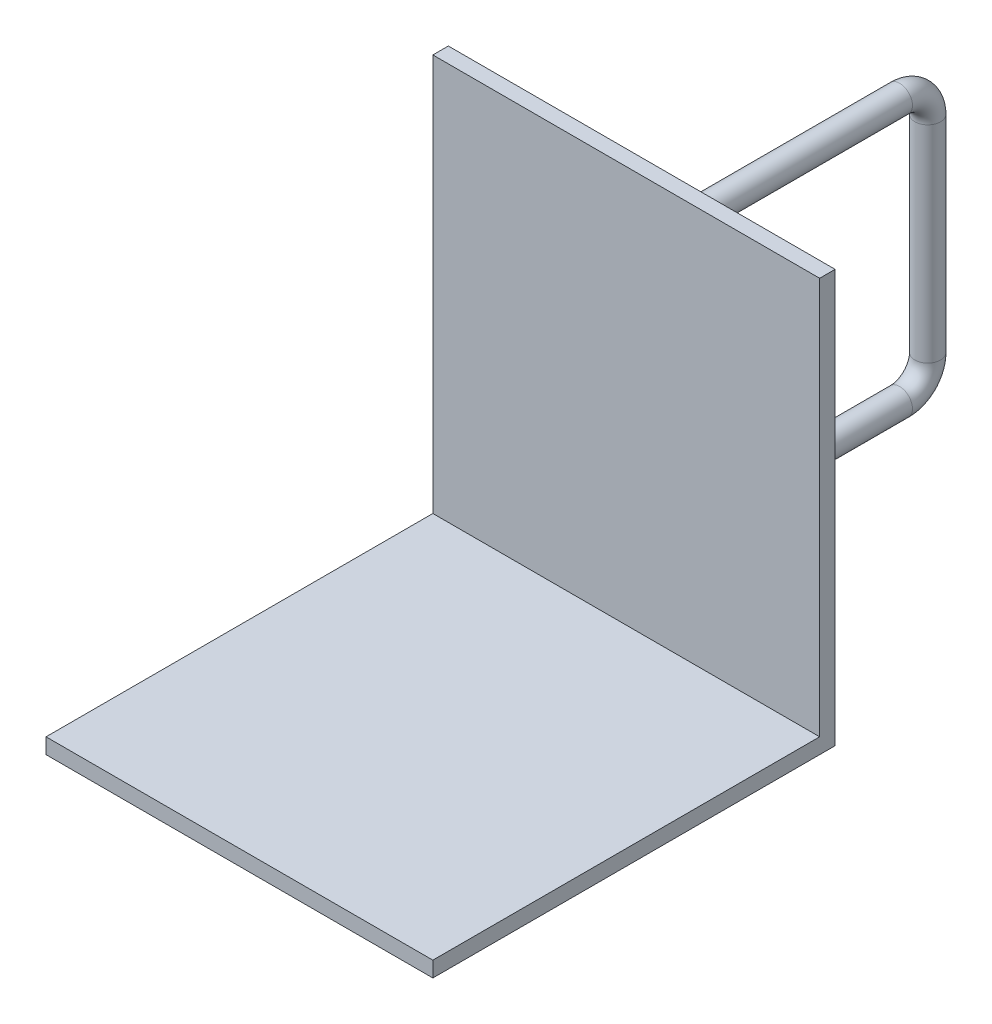
ISO-10303-21;
HEADER;
FILE_DESCRIPTION(('STEP AP214'),'2;1');
FILE_NAME('part.step','',(''),(''),'','','');
FILE_SCHEMA(('AUTOMOTIVE_DESIGN { 1 0 10303 214 1 1 1 1 }'));
ENDSEC;
DATA;
#1=APPLICATION_CONTEXT('core data for automotive mechanical design processes');
#2=APPLICATION_PROTOCOL_DEFINITION('international standard','automotive_design',2000,#1);
#3=PRODUCT_CONTEXT('',#1,'mechanical');
#4=PRODUCT('Part','Part','',(#3));
#5=PRODUCT_RELATED_PRODUCT_CATEGORY('part','',(#4));
#6=PRODUCT_DEFINITION_FORMATION('','',#4);
#7=PRODUCT_DEFINITION_CONTEXT('part definition',#1,'design');
#8=PRODUCT_DEFINITION('design','',#6,#7);
#9=PRODUCT_DEFINITION_SHAPE('','',#8);
#10=(LENGTH_UNIT() NAMED_UNIT(*) SI_UNIT(.MILLI.,.METRE.));
#11=(NAMED_UNIT(*) PLANE_ANGLE_UNIT() SI_UNIT($,.RADIAN.));
#12=(NAMED_UNIT(*) SI_UNIT($,.STERADIAN.) SOLID_ANGLE_UNIT());
#13=UNCERTAINTY_MEASURE_WITH_UNIT(LENGTH_MEASURE(1.E-05),#10,'distance_accuracy_value','');
#14=(GEOMETRIC_REPRESENTATION_CONTEXT(3) GLOBAL_UNCERTAINTY_ASSIGNED_CONTEXT((#13)) GLOBAL_UNIT_ASSIGNED_CONTEXT((#10,
#11,#12)) REPRESENTATION_CONTEXT('',''));
#15=CARTESIAN_POINT('',(0.,0.,0.));
#16=DIRECTION('',(0.,0.,1.));
#17=DIRECTION('',(1.,0.,0.));
#18=AXIS2_PLACEMENT_3D('',#15,#16,#17);
#19=CARTESIAN_POINT('',(0.,0.,3.));
#20=DIRECTION('',(-1.,0.,0.));
#21=DIRECTION('',(0.,0.,1.));
#22=AXIS2_PLACEMENT_3D('',#19,#20,#21);
#23=PLANE('',#22);
#24=DIRECTION('',(0.,1.,0.));
#25=VECTOR('',#24,1.);
#26=CARTESIAN_POINT('',(0.,0.,0.));
#27=LINE('',#26,#25);
#28=CARTESIAN_POINT('',(0.,0.,0.));
#29=VERTEX_POINT('',#28);
#30=CARTESIAN_POINT('',(0.,80.,0.));
#31=VERTEX_POINT('',#30);
#32=EDGE_CURVE('E92',#29,#31,#27,.T.);
#33=ORIENTED_EDGE('',*,*,#32,.T.);
#34=DIRECTION('',(0.,0.,-1.));
#35=VECTOR('',#34,1.);
#36=CARTESIAN_POINT('',(0.,80.,3.));
#37=LINE('',#36,#35);
#38=CARTESIAN_POINT('',(0.,80.,3.));
#39=VERTEX_POINT('',#38);
#40=EDGE_CURVE('E11',#39,#31,#37,.T.);
#41=ORIENTED_EDGE('',*,*,#40,.F.);
#42=DIRECTION('',(0.,1.,0.));
#43=VECTOR('',#42,1.);
#44=CARTESIAN_POINT('',(0.,0.,3.));
#45=LINE('',#44,#43);
#46=CARTESIAN_POINT('',(0.,3.,3.));
#47=VERTEX_POINT('',#46);
#48=EDGE_CURVE('E85',#47,#39,#45,.T.);
#49=ORIENTED_EDGE('',*,*,#48,.F.);
#50=DIRECTION('',(0.,0.,-1.));
#51=VECTOR('',#50,1.);
#52=CARTESIAN_POINT('',(0.,3.,78.));
#53=LINE('',#52,#51);
#54=CARTESIAN_POINT('',(0.,3.,78.));
#55=VERTEX_POINT('',#54);
#56=EDGE_CURVE('E100',#55,#47,#53,.T.);
#57=ORIENTED_EDGE('',*,*,#56,.F.);
#58=DIRECTION('',(0.,1.,0.));
#59=VECTOR('',#58,1.);
#60=CARTESIAN_POINT('',(0.,0.,78.));
#61=LINE('',#60,#59);
#62=CARTESIAN_POINT('',(0.,0.,78.));
#63=VERTEX_POINT('',#62);
#64=EDGE_CURVE('E95',#63,#55,#61,.T.);
#65=ORIENTED_EDGE('',*,*,#64,.F.);
#66=DIRECTION('',(0.,0.,-1.));
#67=VECTOR('',#66,1.);
#68=CARTESIAN_POINT('',(0.,0.,3.));
#69=LINE('',#68,#67);
#70=EDGE_CURVE('E78',#63,#29,#69,.T.);
#71=ORIENTED_EDGE('',*,*,#70,.T.);
#72=EDGE_LOOP('',(#33,#41,#49,#57,#65,#71));
#73=FACE_BOUND('',#72,.T.);
#74=ADVANCED_FACE('F33',(#73),#23,.F.);
#75=CARTESIAN_POINT('',(0.,80.,3.));
#76=DIRECTION('',(0.,-1.,0.));
#77=DIRECTION('',(1.,0.,0.));
#78=AXIS2_PLACEMENT_3D('',#75,#76,#77);
#79=PLANE('',#78);
#80=DIRECTION('',(-1.,0.,0.));
#81=VECTOR('',#80,1.);
#82=CARTESIAN_POINT('',(0.,80.,0.));
#83=LINE('',#82,#81);
#84=CARTESIAN_POINT('',(-75.,80.,0.));
#85=VERTEX_POINT('',#84);
#86=EDGE_CURVE('E99',#31,#85,#83,.T.);
#87=ORIENTED_EDGE('',*,*,#86,.T.);
#88=DIRECTION('',(0.,0.,-1.));
#89=VECTOR('',#88,1.);
#90=CARTESIAN_POINT('',(-75.,80.,3.));
#91=LINE('',#90,#89);
#92=CARTESIAN_POINT('',(-75.,80.,3.));
#93=VERTEX_POINT('',#92);
#94=EDGE_CURVE('E41',#93,#85,#91,.T.);
#95=ORIENTED_EDGE('',*,*,#94,.F.);
#96=DIRECTION('',(-1.,0.,0.));
#97=VECTOR('',#96,1.);
#98=CARTESIAN_POINT('',(0.,80.,3.));
#99=LINE('',#98,#97);
#100=EDGE_CURVE('E54',#39,#93,#99,.T.);
#101=ORIENTED_EDGE('',*,*,#100,.F.);
#102=ORIENTED_EDGE('',*,*,#40,.T.);
#103=EDGE_LOOP('',(#87,#95,#101,#102));
#104=FACE_BOUND('',#103,.T.);
#105=ADVANCED_FACE('F117',(#104),#79,.F.);
#106=CARTESIAN_POINT('',(-75.,0.,3.));
#107=DIRECTION('',(1.,0.,0.));
#108=DIRECTION('',(0.,0.,-1.));
#109=AXIS2_PLACEMENT_3D('',#106,#107,#108);
#110=PLANE('',#109);
#111=DIRECTION('',(0.,-1.,0.));
#112=VECTOR('',#111,1.);
#113=CARTESIAN_POINT('',(-75.,0.,0.));
#114=LINE('',#113,#112);
#115=CARTESIAN_POINT('',(-75.,0.,0.));
#116=VERTEX_POINT('',#115);
#117=EDGE_CURVE('E86',#85,#116,#114,.T.);
#118=ORIENTED_EDGE('',*,*,#117,.T.);
#119=DIRECTION('',(0.,0.,-1.));
#120=VECTOR('',#119,1.);
#121=CARTESIAN_POINT('',(-75.,0.,3.));
#122=LINE('',#121,#120);
#123=CARTESIAN_POINT('',(-75.,0.,78.));
#124=VERTEX_POINT('',#123);
#125=EDGE_CURVE('E81',#124,#116,#122,.T.);
#126=ORIENTED_EDGE('',*,*,#125,.F.);
#127=DIRECTION('',(0.,-1.,0.));
#128=VECTOR('',#127,1.);
#129=CARTESIAN_POINT('',(-75.,0.,78.));
#130=LINE('',#129,#128);
#131=CARTESIAN_POINT('',(-75.,2.99999999999999,78.));
#132=VERTEX_POINT('',#131);
#133=EDGE_CURVE('E132',#132,#124,#130,.T.);
#134=ORIENTED_EDGE('',*,*,#133,.F.);
#135=DIRECTION('',(0.,0.,-1.));
#136=VECTOR('',#135,1.);
#137=CARTESIAN_POINT('',(-75.,2.99999999999999,78.));
#138=LINE('',#137,#136);
#139=CARTESIAN_POINT('',(-75.,2.99999999999999,3.));
#140=VERTEX_POINT('',#139);
#141=EDGE_CURVE('E104',#132,#140,#138,.T.);
#142=ORIENTED_EDGE('',*,*,#141,.T.);
#143=DIRECTION('',(0.,-1.,0.));
#144=VECTOR('',#143,1.);
#145=CARTESIAN_POINT('',(-75.,0.,3.));
#146=LINE('',#145,#144);
#147=EDGE_CURVE('E96',#93,#140,#146,.T.);
#148=ORIENTED_EDGE('',*,*,#147,.F.);
#149=ORIENTED_EDGE('',*,*,#94,.T.);
#150=EDGE_LOOP('',(#118,#126,#134,#142,#148,#149));
#151=FACE_BOUND('',#150,.T.);
#152=ADVANCED_FACE('F114',(#151),#110,.F.);
#153=CARTESIAN_POINT('',(0.,0.,3.));
#154=DIRECTION('',(0.,1.,0.));
#155=DIRECTION('',(-1.,0.,0.));
#156=AXIS2_PLACEMENT_3D('',#153,#154,#155);
#157=PLANE('',#156);
#158=DIRECTION('',(1.,0.,0.));
#159=VECTOR('',#158,1.);
#160=CARTESIAN_POINT('',(0.,0.,0.));
#161=LINE('',#160,#159);
#162=EDGE_CURVE('E74',#116,#29,#161,.T.);
#163=ORIENTED_EDGE('',*,*,#162,.T.);
#164=ORIENTED_EDGE('',*,*,#70,.F.);
#165=DIRECTION('',(1.,0.,0.));
#166=VECTOR('',#165,1.);
#167=CARTESIAN_POINT('',(0.,0.,78.));
#168=LINE('',#167,#166);
#169=EDGE_CURVE('E135',#124,#63,#168,.T.);
#170=ORIENTED_EDGE('',*,*,#169,.F.);
#171=ORIENTED_EDGE('',*,*,#125,.T.);
#172=EDGE_LOOP('',(#163,#164,#170,#171));
#173=FACE_BOUND('',#172,.T.);
#174=ADVANCED_FACE('F76',(#173),#157,.F.);
#175=CARTESIAN_POINT('',(0.,0.,3.));
#176=DIRECTION('',(0.,0.,1.));
#177=DIRECTION('',(1.,0.,0.));
#178=AXIS2_PLACEMENT_3D('',#175,#176,#177);
#179=PLANE('',#178);
#180=DIRECTION('',(-1.,0.,0.));
#181=VECTOR('',#180,1.);
#182=CARTESIAN_POINT('',(0.,3.,3.));
#183=LINE('',#182,#181);
#184=EDGE_CURVE('E48',#47,#140,#183,.T.);
#185=ORIENTED_EDGE('',*,*,#184,.F.);
#186=ORIENTED_EDGE('',*,*,#48,.T.);
#187=ORIENTED_EDGE('',*,*,#100,.T.);
#188=ORIENTED_EDGE('',*,*,#147,.T.);
#189=EDGE_LOOP('',(#185,#186,#187,#188));
#190=FACE_BOUND('',#189,.T.);
#191=ADVANCED_FACE('F144',(#190),#179,.T.);
#192=CARTESIAN_POINT('',(0.,0.,0.));
#193=DIRECTION('',(0.,0.,1.));
#194=DIRECTION('',(1.,0.,0.));
#195=AXIS2_PLACEMENT_3D('',#192,#193,#194);
#196=PLANE('',#195);
#197=CARTESIAN_POINT('',(-37.5,14.0827789703073,0.));
#198=DIRECTION('',(0.,0.,1.));
#199=DIRECTION('',(-1.,0.,0.));
#200=AXIS2_PLACEMENT_3D('',#197,#198,#199);
#201=CIRCLE('',#200,2.5);
#202=CARTESIAN_POINT('',(-40.,14.0827789703073,0.));
#203=VERTEX_POINT('',#202);
#204=EDGE_CURVE('E139',#203,#203,#201,.T.);
#205=ORIENTED_EDGE('',*,*,#204,.T.);
#206=EDGE_LOOP('',(#205));
#207=FACE_BOUND('',#206,.T.);
#208=CARTESIAN_POINT('',(-37.5,65.,0.));
#209=DIRECTION('',(0.,0.,1.));
#210=DIRECTION('',(1.,0.,0.));
#211=AXIS2_PLACEMENT_3D('',#208,#209,#210);
#212=CIRCLE('',#211,2.5);
#213=CARTESIAN_POINT('',(-35.,65.,0.));
#214=VERTEX_POINT('',#213);
#215=EDGE_CURVE('E36',#214,#214,#212,.T.);
#216=ORIENTED_EDGE('',*,*,#215,.T.);
#217=EDGE_LOOP('',(#216));
#218=FACE_BOUND('',#217,.T.);
#219=ORIENTED_EDGE('',*,*,#32,.F.);
#220=ORIENTED_EDGE('',*,*,#162,.F.);
#221=ORIENTED_EDGE('',*,*,#117,.F.);
#222=ORIENTED_EDGE('',*,*,#86,.F.);
#223=EDGE_LOOP('',(#219,#220,#221,#222));
#224=FACE_BOUND('',#223,.T.);
#225=ADVANCED_FACE('F98',(#207,#218,#224),#196,.F.);
#226=CARTESIAN_POINT('',(0.,3.,78.));
#227=DIRECTION('',(0.,-1.,0.));
#228=DIRECTION('',(1.,0.,0.));
#229=AXIS2_PLACEMENT_3D('',#226,#227,#228);
#230=PLANE('',#229);
#231=ORIENTED_EDGE('',*,*,#184,.T.);
#232=ORIENTED_EDGE('',*,*,#141,.F.);
#233=DIRECTION('',(-1.,0.,0.));
#234=VECTOR('',#233,1.);
#235=CARTESIAN_POINT('',(0.,3.,78.));
#236=LINE('',#235,#234);
#237=EDGE_CURVE('E126',#55,#132,#236,.T.);
#238=ORIENTED_EDGE('',*,*,#237,.F.);
#239=ORIENTED_EDGE('',*,*,#56,.T.);
#240=EDGE_LOOP('',(#231,#232,#238,#239));
#241=FACE_BOUND('',#240,.T.);
#242=ADVANCED_FACE('F122',(#241),#230,.F.);
#243=CARTESIAN_POINT('',(0.,0.,78.));
#244=DIRECTION('',(0.,0.,1.));
#245=DIRECTION('',(1.,0.,0.));
#246=AXIS2_PLACEMENT_3D('',#243,#244,#245);
#247=PLANE('',#246);
#248=ORIENTED_EDGE('',*,*,#64,.T.);
#249=ORIENTED_EDGE('',*,*,#237,.T.);
#250=ORIENTED_EDGE('',*,*,#133,.T.);
#251=ORIENTED_EDGE('',*,*,#169,.T.);
#252=EDGE_LOOP('',(#248,#249,#250,#251));
#253=FACE_BOUND('',#252,.T.);
#254=ADVANCED_FACE('F134',(#253),#247,.T.);
#255=CARTESIAN_POINT('',(-37.5,65.,-0.0999999999999998));
#256=DIRECTION('',(0.,0.,1.));
#257=DIRECTION('',(1.,0.,0.));
#258=AXIS2_PLACEMENT_3D('',#255,#256,#257);
#259=CYLINDRICAL_SURFACE('',#258,2.5);
#260=ORIENTED_EDGE('',*,*,#215,.F.);
#261=EDGE_LOOP('',(#260));
#262=FACE_BOUND('',#261,.T.);
#263=CARTESIAN_POINT('',(-37.5,65.,-50.));
#264=DIRECTION('',(0.,0.,-1.));
#265=DIRECTION('',(-1.,0.,0.));
#266=AXIS2_PLACEMENT_3D('',#263,#264,#265);
#267=CIRCLE('',#266,2.5);
#268=CARTESIAN_POINT('',(-37.5,67.5,-50.));
#269=VERTEX_POINT('',#268);
#270=EDGE_CURVE('E268',#269,#269,#267,.T.);
#271=ORIENTED_EDGE('',*,*,#270,.F.);
#272=EDGE_LOOP('',(#271));
#273=FACE_BOUND('',#272,.T.);
#274=ADVANCED_FACE('F189',(#262,#273),#259,.T.);
#275=CARTESIAN_POINT('',(-37.5,59.5413894851536,-50.));
#276=DIRECTION('',(-1.,0.,0.));
#277=DIRECTION('',(0.,0.,1.));
#278=AXIS2_PLACEMENT_3D('',#275,#276,#277);
#279=TOROIDAL_SURFACE('',#278,5.45861051484636,2.5);
#280=CARTESIAN_POINT('',(-37.5,59.5413894851536,-55.4586105148463));
#281=DIRECTION('',(0.,-1.,0.));
#282=DIRECTION('',(-1.,0.,0.));
#283=AXIS2_PLACEMENT_3D('',#280,#281,#282);
#284=CIRCLE('',#283,2.5);
#285=CARTESIAN_POINT('',(-37.5,59.5413894851536,-57.9586105148464));
#286=VERTEX_POINT('',#285);
#287=EDGE_CURVE('E263',#286,#286,#284,.T.);
#288=CARTESIAN_POINT('',(-37.5,59.5413894851536,-50.));
#289=DIRECTION('',(-1.,0.,0.));
#290=DIRECTION('',(0.,0.,1.));
#291=AXIS2_PLACEMENT_3D('',#288,#289,#290);
#292=CIRCLE('',#291,7.95861051484636);
#293=EDGE_CURVE('',#269,#286,#292,.T.);
#294=ORIENTED_EDGE('',*,*,#270,.T.);
#295=ORIENTED_EDGE('',*,*,#287,.F.);
#296=ORIENTED_EDGE('',*,*,#293,.T.);
#297=ORIENTED_EDGE('',*,*,#293,.F.);
#298=EDGE_LOOP('',(#294,#296,#295,#297));
#299=FACE_BOUND('',#298,.T.);
#300=ADVANCED_FACE('F211',(#299),#279,.T.);
#301=CARTESIAN_POINT('',(-37.5,59.5413894851536,-55.4586105148463));
#302=DIRECTION('',(0.,-1.,0.));
#303=DIRECTION('',(0.,0.,-1.));
#304=AXIS2_PLACEMENT_3D('',#301,#302,#303);
#305=CYLINDRICAL_SURFACE('',#304,2.5);
#306=CARTESIAN_POINT('',(-37.5,19.5413894851536,-55.4586105148464));
#307=DIRECTION('',(0.,-1.,0.));
#308=DIRECTION('',(-1.,0.,0.));
#309=AXIS2_PLACEMENT_3D('',#306,#307,#308);
#310=CIRCLE('',#309,2.5);
#311=CARTESIAN_POINT('',(-37.5,19.5413894851536,-57.9586105148464));
#312=VERTEX_POINT('',#311);
#313=EDGE_CURVE('E261',#312,#312,#310,.T.);
#314=ORIENTED_EDGE('',*,*,#313,.F.);
#315=EDGE_LOOP('',(#314));
#316=FACE_BOUND('',#315,.T.);
#317=ORIENTED_EDGE('',*,*,#287,.T.);
#318=EDGE_LOOP('',(#317));
#319=FACE_BOUND('',#318,.T.);
#320=ADVANCED_FACE('F222',(#316,#319),#305,.T.);
#321=CARTESIAN_POINT('',(-37.5,19.5413894851536,-50.));
#322=DIRECTION('',(-1.,0.,0.));
#323=DIRECTION('',(0.,0.,1.));
#324=AXIS2_PLACEMENT_3D('',#321,#322,#323);
#325=TOROIDAL_SURFACE('',#324,5.45861051484636,2.5);
#326=CARTESIAN_POINT('',(-37.5,14.0827789703073,-50.));
#327=DIRECTION('',(0.,0.,1.));
#328=DIRECTION('',(-1.,0.,0.));
#329=AXIS2_PLACEMENT_3D('',#326,#327,#328);
#330=CIRCLE('',#329,2.5);
#331=CARTESIAN_POINT('',(-37.5,11.5827789703073,-50.));
#332=VERTEX_POINT('',#331);
#333=EDGE_CURVE('E260',#332,#332,#330,.T.);
#334=CARTESIAN_POINT('',(-37.5,19.5413894851536,-50.));
#335=DIRECTION('',(-1.,0.,0.));
#336=DIRECTION('',(0.,0.,1.));
#337=AXIS2_PLACEMENT_3D('',#334,#335,#336);
#338=CIRCLE('',#337,7.95861051484636);
#339=EDGE_CURVE('',#312,#332,#338,.T.);
#340=ORIENTED_EDGE('',*,*,#313,.T.);
#341=ORIENTED_EDGE('',*,*,#333,.F.);
#342=ORIENTED_EDGE('',*,*,#339,.T.);
#343=ORIENTED_EDGE('',*,*,#339,.F.);
#344=EDGE_LOOP('',(#340,#342,#341,#343));
#345=FACE_BOUND('',#344,.T.);
#346=ADVANCED_FACE('F232',(#345),#325,.T.);
#347=CARTESIAN_POINT('',(-37.5,14.0827789703073,-50.));
#348=DIRECTION('',(0.,0.,1.));
#349=DIRECTION('',(0.,-1.,0.));
#350=AXIS2_PLACEMENT_3D('',#347,#348,#349);
#351=CYLINDRICAL_SURFACE('',#350,2.5);
#352=ORIENTED_EDGE('',*,*,#204,.F.);
#353=EDGE_LOOP('',(#352));
#354=FACE_BOUND('',#353,.T.);
#355=ORIENTED_EDGE('',*,*,#333,.T.);
#356=EDGE_LOOP('',(#355));
#357=FACE_BOUND('',#356,.T.);
#358=ADVANCED_FACE('F214',(#354,#357),#351,.T.);
#359=CLOSED_SHELL('',(#74,#105,#152,#174,#191,#225,#242,#254,#274,#300,#320,#346,#358));
#360=MANIFOLD_SOLID_BREP('B2',#359);
#361=ADVANCED_BREP_SHAPE_REPRESENTATION('',(#18,#360),#14);
#362=SHAPE_DEFINITION_REPRESENTATION(#9,#361);
ENDSEC;
END-ISO-10303-21;
